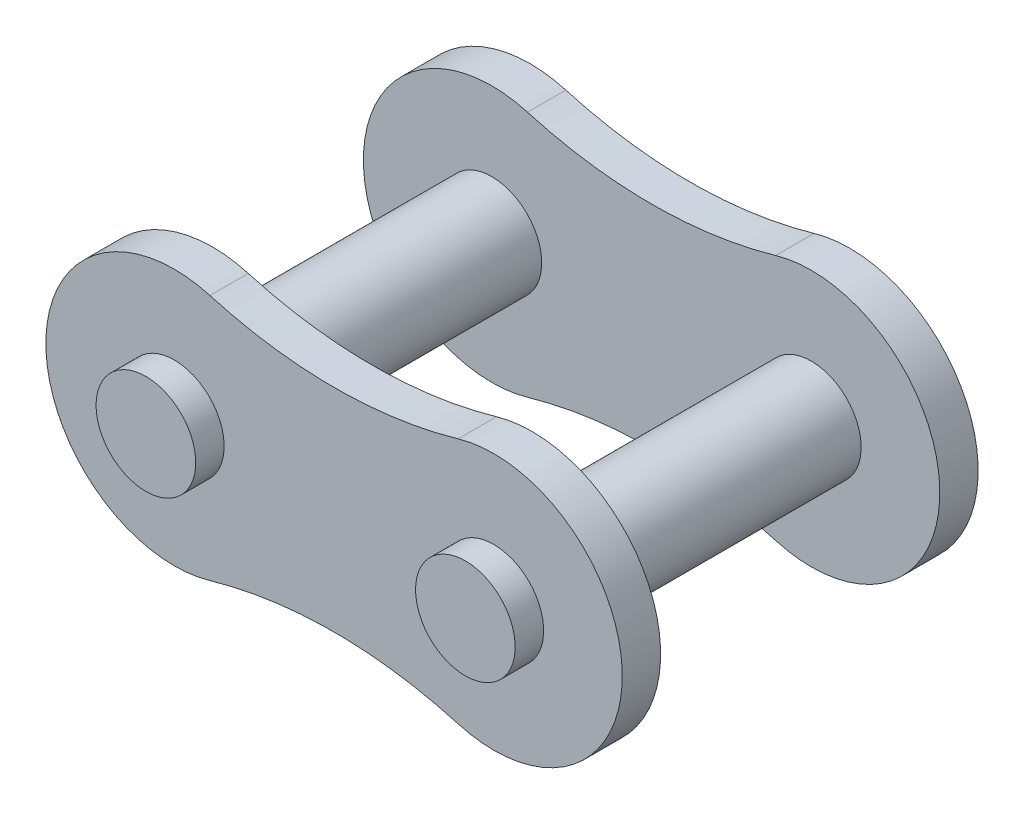
ISO-10303-21;
HEADER;
FILE_DESCRIPTION(('STEP AP214'),'2;1');
FILE_NAME('part.step','',(''),(''),'','','');
FILE_SCHEMA(('AUTOMOTIVE_DESIGN { 1 0 10303 214 1 1 1 1 }'));
ENDSEC;
DATA;
#1=APPLICATION_CONTEXT('core data for automotive mechanical design processes');
#2=APPLICATION_PROTOCOL_DEFINITION('international standard','automotive_design',2000,#1);
#3=PRODUCT_CONTEXT('',#1,'mechanical');
#4=PRODUCT('Part','Part','',(#3));
#5=PRODUCT_RELATED_PRODUCT_CATEGORY('part','',(#4));
#6=PRODUCT_DEFINITION_FORMATION('','',#4);
#7=PRODUCT_DEFINITION_CONTEXT('part definition',#1,'design');
#8=PRODUCT_DEFINITION('design','',#6,#7);
#9=PRODUCT_DEFINITION_SHAPE('','',#8);
#10=(LENGTH_UNIT() NAMED_UNIT(*) SI_UNIT(.MILLI.,.METRE.));
#11=(NAMED_UNIT(*) PLANE_ANGLE_UNIT() SI_UNIT($,.RADIAN.));
#12=(NAMED_UNIT(*) SI_UNIT($,.STERADIAN.) SOLID_ANGLE_UNIT());
#13=UNCERTAINTY_MEASURE_WITH_UNIT(LENGTH_MEASURE(1.E-05),#10,'distance_accuracy_value','');
#14=(GEOMETRIC_REPRESENTATION_CONTEXT(3) GLOBAL_UNCERTAINTY_ASSIGNED_CONTEXT((#13)) GLOBAL_UNIT_ASSIGNED_CONTEXT((#10,
#11,#12)) REPRESENTATION_CONTEXT('',''));
#15=CARTESIAN_POINT('',(0.,0.,0.));
#16=DIRECTION('',(0.,0.,1.));
#17=DIRECTION('',(1.,0.,0.));
#18=AXIS2_PLACEMENT_3D('',#15,#16,#17);
#19=CARTESIAN_POINT('',(44.45,0.,8.2042));
#20=DIRECTION('',(0.,0.,1.));
#21=DIRECTION('',(1.,0.,0.));
#22=AXIS2_PLACEMENT_3D('',#19,#20,#21);
#23=PLANE('',#22);
#24=CARTESIAN_POINT('',(44.45,0.,8.2042));
#25=DIRECTION('',(0.,0.,-1.));
#26=DIRECTION('',(-1.,0.,0.));
#27=AXIS2_PLACEMENT_3D('',#24,#25,#26);
#28=CIRCLE('',#27,1.9812);
#29=CARTESIAN_POINT('',(42.4688,0.,8.2042));
#30=VERTEX_POINT('',#29);
#31=EDGE_CURVE('E20',#30,#30,#28,.T.);
#32=ORIENTED_EDGE('',*,*,#31,.F.);
#33=EDGE_LOOP('',(#32));
#34=FACE_BOUND('',#33,.T.);
#35=ADVANCED_FACE('F17',(#34),#23,.T.);
#36=CARTESIAN_POINT('',(31.75,0.,8.2042));
#37=DIRECTION('',(0.,0.,1.));
#38=DIRECTION('',(1.,0.,0.));
#39=AXIS2_PLACEMENT_3D('',#36,#37,#38);
#40=PLANE('',#39);
#41=CARTESIAN_POINT('',(31.75,0.,8.2042));
#42=DIRECTION('',(0.,0.,-1.));
#43=DIRECTION('',(-1.,0.,0.));
#44=AXIS2_PLACEMENT_3D('',#41,#42,#43);
#45=CIRCLE('',#44,1.9812);
#46=CARTESIAN_POINT('',(29.7688,0.,8.2042));
#47=VERTEX_POINT('',#46);
#48=EDGE_CURVE('E171',#47,#47,#45,.T.);
#49=ORIENTED_EDGE('',*,*,#48,.F.);
#50=EDGE_LOOP('',(#49));
#51=FACE_BOUND('',#50,.T.);
#52=ADVANCED_FACE('F181',(#51),#40,.T.);
#53=CARTESIAN_POINT('',(44.45,0.,8.2042));
#54=DIRECTION('',(0.,0.,-1.));
#55=DIRECTION('',(-1.,0.,0.));
#56=AXIS2_PLACEMENT_3D('',#53,#54,#55);
#57=CYLINDRICAL_SURFACE('',#56,1.9812);
#58=CARTESIAN_POINT('',(44.45,0.,7.0739));
#59=DIRECTION('',(0.,0.,-1.));
#60=DIRECTION('',(-1.,0.,0.));
#61=AXIS2_PLACEMENT_3D('',#58,#59,#60);
#62=CIRCLE('',#61,1.9812);
#63=CARTESIAN_POINT('',(42.4688,0.,7.0739));
#64=VERTEX_POINT('',#63);
#65=EDGE_CURVE('E169',#64,#64,#62,.F.);
#66=ORIENTED_EDGE('',*,*,#65,.T.);
#67=EDGE_LOOP('',(#66));
#68=FACE_BOUND('',#67,.T.);
#69=ORIENTED_EDGE('',*,*,#31,.T.);
#70=EDGE_LOOP('',(#69));
#71=FACE_BOUND('',#70,.T.);
#72=ADVANCED_FACE('F178',(#68,#71),#57,.T.);
#73=CARTESIAN_POINT('',(31.75,0.,8.2042));
#74=DIRECTION('',(0.,0.,-1.));
#75=DIRECTION('',(-1.,0.,0.));
#76=AXIS2_PLACEMENT_3D('',#73,#74,#75);
#77=CYLINDRICAL_SURFACE('',#76,1.9812);
#78=ORIENTED_EDGE('',*,*,#48,.T.);
#79=EDGE_LOOP('',(#78));
#80=FACE_BOUND('',#79,.T.);
#81=CARTESIAN_POINT('',(31.75,0.,7.0739));
#82=DIRECTION('',(0.,0.,-1.));
#83=DIRECTION('',(-1.,0.,0.));
#84=AXIS2_PLACEMENT_3D('',#81,#82,#83);
#85=CIRCLE('',#84,1.9812);
#86=CARTESIAN_POINT('',(29.7688,0.,7.0739));
#87=VERTEX_POINT('',#86);
#88=EDGE_CURVE('E166',#87,#87,#85,.F.);
#89=ORIENTED_EDGE('',*,*,#88,.T.);
#90=EDGE_LOOP('',(#89));
#91=FACE_BOUND('',#90,.T.);
#92=ADVANCED_FACE('F256',(#80,#91),#77,.T.);
#93=CARTESIAN_POINT('',(44.45,0.,-8.2042));
#94=DIRECTION('',(0.,0.,1.));
#95=DIRECTION('',(1.,0.,0.));
#96=AXIS2_PLACEMENT_3D('',#93,#94,#95);
#97=PLANE('',#96);
#98=CARTESIAN_POINT('',(44.45,0.,-8.20420000000001));
#99=DIRECTION('',(0.,0.,-1.));
#100=DIRECTION('',(-1.,0.,0.));
#101=AXIS2_PLACEMENT_3D('',#98,#99,#100);
#102=CIRCLE('',#101,1.9812);
#103=CARTESIAN_POINT('',(42.4688,0.,-8.20420000000001));
#104=VERTEX_POINT('',#103);
#105=EDGE_CURVE('E163',#104,#104,#102,.F.);
#106=ORIENTED_EDGE('',*,*,#105,.F.);
#107=EDGE_LOOP('',(#106));
#108=FACE_BOUND('',#107,.T.);
#109=ADVANCED_FACE('F252',(#108),#97,.F.);
#110=CARTESIAN_POINT('',(31.75,0.,-8.2042));
#111=DIRECTION('',(0.,0.,1.));
#112=DIRECTION('',(1.,0.,0.));
#113=AXIS2_PLACEMENT_3D('',#110,#111,#112);
#114=PLANE('',#113);
#115=CARTESIAN_POINT('',(31.75,0.,-8.20420000000001));
#116=DIRECTION('',(0.,0.,-1.));
#117=DIRECTION('',(-1.,0.,0.));
#118=AXIS2_PLACEMENT_3D('',#115,#116,#117);
#119=CIRCLE('',#118,1.9812);
#120=CARTESIAN_POINT('',(29.7688,0.,-8.20420000000001));
#121=VERTEX_POINT('',#120);
#122=EDGE_CURVE('E98',#121,#121,#119,.F.);
#123=ORIENTED_EDGE('',*,*,#122,.F.);
#124=EDGE_LOOP('',(#123));
#125=FACE_BOUND('',#124,.T.);
#126=ADVANCED_FACE('F248',(#125),#114,.F.);
#127=CARTESIAN_POINT('',(41.275,10.9994867117524,7.0739));
#128=DIRECTION('',(0.,0.,-1.));
#129=DIRECTION('',(-1.,0.,0.));
#130=AXIS2_PLACEMENT_3D('',#127,#128,#129);
#131=PLANE('',#130);
#132=ORIENTED_EDGE('',*,*,#88,.F.);
#133=EDGE_LOOP('',(#132));
#134=FACE_BOUND('',#133,.T.);
#135=ORIENTED_EDGE('',*,*,#65,.F.);
#136=EDGE_LOOP('',(#135));
#137=FACE_BOUND('',#136,.T.);
#138=CARTESIAN_POINT('',(31.75,0.,7.0739));
#139=DIRECTION('',(0.,0.,-1.));
#140=DIRECTION('',(-1.,0.,0.));
#141=AXIS2_PLACEMENT_3D('',#138,#139,#140);
#142=CIRCLE('',#141,5.107432);
#143=CARTESIAN_POINT('',(33.1664321581491,-4.90709502414467,7.0739));
#144=VERTEX_POINT('',#143);
#145=CARTESIAN_POINT('',(33.1664321581491,4.90709502414467,7.0739));
#146=VERTEX_POINT('',#145);
#147=EDGE_CURVE('E158',#144,#146,#142,.T.);
#148=ORIENTED_EDGE('',*,*,#147,.F.);
#149=CARTESIAN_POINT('',(38.1,-21.9989734235048,7.0739));
#150=DIRECTION('',(0.,0.,-1.));
#151=DIRECTION('',(-1.,0.,0.));
#152=AXIS2_PLACEMENT_3D('',#149,#150,#151);
#153=CIRCLE('',#152,17.7896711287381);
#154=CARTESIAN_POINT('',(43.0335678418509,-4.90709502414468,7.0739));
#155=VERTEX_POINT('',#154);
#156=EDGE_CURVE('E86',#144,#155,#153,.T.);
#157=ORIENTED_EDGE('',*,*,#156,.T.);
#158=CARTESIAN_POINT('',(44.45,0.,7.0739));
#159=DIRECTION('',(0.,0.,-1.));
#160=DIRECTION('',(-1.,0.,0.));
#161=AXIS2_PLACEMENT_3D('',#158,#159,#160);
#162=CIRCLE('',#161,5.107432);
#163=CARTESIAN_POINT('',(43.0335678418509,4.90709502414463,7.0739));
#164=VERTEX_POINT('',#163);
#165=EDGE_CURVE('E80',#164,#155,#162,.T.);
#166=ORIENTED_EDGE('',*,*,#165,.F.);
#167=CARTESIAN_POINT('',(38.1,21.9989734235048,7.0739));
#168=DIRECTION('',(0.,0.,-1.));
#169=DIRECTION('',(-1.,0.,0.));
#170=AXIS2_PLACEMENT_3D('',#167,#168,#169);
#171=CIRCLE('',#170,17.7896711287381);
#172=EDGE_CURVE('E84',#164,#146,#171,.T.);
#173=ORIENTED_EDGE('',*,*,#172,.T.);
#174=EDGE_LOOP('',(#148,#157,#166,#173));
#175=FACE_BOUND('',#174,.T.);
#176=ADVANCED_FACE('F83',(#134,#137,#175),#131,.F.);
#177=CARTESIAN_POINT('',(44.45,0.,8.2042));
#178=DIRECTION('',(0.,0.,-1.));
#179=DIRECTION('',(-1.,0.,0.));
#180=AXIS2_PLACEMENT_3D('',#177,#178,#179);
#181=CYLINDRICAL_SURFACE('',#180,1.9812);
#182=ORIENTED_EDGE('',*,*,#105,.T.);
#183=EDGE_LOOP('',(#182));
#184=FACE_BOUND('',#183,.T.);
#185=CARTESIAN_POINT('',(44.45,0.,-7.0739));
#186=DIRECTION('',(0.,0.,-1.));
#187=DIRECTION('',(-1.,0.,0.));
#188=AXIS2_PLACEMENT_3D('',#185,#186,#187);
#189=CIRCLE('',#188,1.9812);
#190=CARTESIAN_POINT('',(42.4688,0.,-7.0739));
#191=VERTEX_POINT('',#190);
#192=EDGE_CURVE('E155',#191,#191,#189,.T.);
#193=ORIENTED_EDGE('',*,*,#192,.T.);
#194=EDGE_LOOP('',(#193));
#195=FACE_BOUND('',#194,.T.);
#196=ADVANCED_FACE('F241',(#184,#195),#181,.T.);
#197=CARTESIAN_POINT('',(31.75,0.,8.2042));
#198=DIRECTION('',(0.,0.,-1.));
#199=DIRECTION('',(-1.,0.,0.));
#200=AXIS2_PLACEMENT_3D('',#197,#198,#199);
#201=CYLINDRICAL_SURFACE('',#200,1.9812);
#202=ORIENTED_EDGE('',*,*,#122,.T.);
#203=EDGE_LOOP('',(#202));
#204=FACE_BOUND('',#203,.T.);
#205=CARTESIAN_POINT('',(31.75,0.,-7.07389999999999));
#206=DIRECTION('',(0.,0.,-1.));
#207=DIRECTION('',(-1.,0.,0.));
#208=AXIS2_PLACEMENT_3D('',#205,#206,#207);
#209=CIRCLE('',#208,1.9812);
#210=CARTESIAN_POINT('',(29.7688,0.,-7.07389999999999));
#211=VERTEX_POINT('',#210);
#212=EDGE_CURVE('E152',#211,#211,#209,.T.);
#213=ORIENTED_EDGE('',*,*,#212,.T.);
#214=EDGE_LOOP('',(#213));
#215=FACE_BOUND('',#214,.T.);
#216=ADVANCED_FACE('F238',(#204,#215),#201,.T.);
#217=CARTESIAN_POINT('',(38.1,21.9989734235048,7.0739));
#218=DIRECTION('',(0.,0.,-1.));
#219=DIRECTION('',(-1.,0.,0.));
#220=AXIS2_PLACEMENT_3D('',#217,#218,#219);
#221=CYLINDRICAL_SURFACE('',#220,17.7896711287381);
#222=DIRECTION('',(0.,0.,-1.));
#223=VECTOR('',#222,1.);
#224=CARTESIAN_POINT('',(33.1664321581491,4.90709502414464,7.0739));
#225=LINE('',#224,#223);
#226=CARTESIAN_POINT('',(33.1664321581491,4.90709502414467,5.5499));
#227=VERTEX_POINT('',#226);
#228=EDGE_CURVE('E96',#146,#227,#225,.T.);
#229=ORIENTED_EDGE('',*,*,#228,.F.);
#230=ORIENTED_EDGE('',*,*,#172,.F.);
#231=DIRECTION('',(0.,0.,-1.));
#232=VECTOR('',#231,1.);
#233=CARTESIAN_POINT('',(43.0335678418508,4.90709502414461,7.0739));
#234=LINE('',#233,#232);
#235=CARTESIAN_POINT('',(43.0335678418509,4.90709502414463,5.5499));
#236=VERTEX_POINT('',#235);
#237=EDGE_CURVE('E90',#236,#164,#234,.F.);
#238=ORIENTED_EDGE('',*,*,#237,.F.);
#239=CARTESIAN_POINT('',(38.1,21.9989734235048,5.5499));
#240=DIRECTION('',(0.,0.,-1.));
#241=DIRECTION('',(-1.,0.,0.));
#242=AXIS2_PLACEMENT_3D('',#239,#240,#241);
#243=CIRCLE('',#242,17.7896711287381);
#244=EDGE_CURVE('E150',#227,#236,#243,.F.);
#245=ORIENTED_EDGE('',*,*,#244,.F.);
#246=EDGE_LOOP('',(#229,#230,#238,#245));
#247=FACE_BOUND('',#246,.T.);
#248=ADVANCED_FACE('F93',(#247),#221,.F.);
#249=CARTESIAN_POINT('',(44.45,0.,7.0739));
#250=DIRECTION('',(0.,0.,-1.));
#251=DIRECTION('',(-1.,0.,0.));
#252=AXIS2_PLACEMENT_3D('',#249,#250,#251);
#253=CYLINDRICAL_SURFACE('',#252,5.107432);
#254=CARTESIAN_POINT('',(44.45,0.,5.5499));
#255=DIRECTION('',(0.,0.,-1.));
#256=DIRECTION('',(-1.,0.,0.));
#257=AXIS2_PLACEMENT_3D('',#254,#255,#256);
#258=CIRCLE('',#257,5.107432);
#259=CARTESIAN_POINT('',(43.0335678418509,-4.90709502414468,5.5499));
#260=VERTEX_POINT('',#259);
#261=EDGE_CURVE('E102',#236,#260,#258,.T.);
#262=ORIENTED_EDGE('',*,*,#261,.F.);
#263=ORIENTED_EDGE('',*,*,#237,.T.);
#264=ORIENTED_EDGE('',*,*,#165,.T.);
#265=DIRECTION('',(0.,0.,-1.));
#266=VECTOR('',#265,1.);
#267=CARTESIAN_POINT('',(43.0335678418508,-4.90709502414466,7.0739));
#268=LINE('',#267,#266);
#269=EDGE_CURVE('E105',#155,#260,#268,.T.);
#270=ORIENTED_EDGE('',*,*,#269,.T.);
#271=EDGE_LOOP('',(#262,#263,#264,#270));
#272=FACE_BOUND('',#271,.T.);
#273=ADVANCED_FACE('F100',(#272),#253,.T.);
#274=CARTESIAN_POINT('',(38.1,-21.9989734235048,7.0739));
#275=DIRECTION('',(0.,0.,-1.));
#276=DIRECTION('',(-1.,0.,0.));
#277=AXIS2_PLACEMENT_3D('',#274,#275,#276);
#278=CYLINDRICAL_SURFACE('',#277,17.7896711287381);
#279=ORIENTED_EDGE('',*,*,#269,.F.);
#280=ORIENTED_EDGE('',*,*,#156,.F.);
#281=DIRECTION('',(0.,0.,-1.));
#282=VECTOR('',#281,1.);
#283=CARTESIAN_POINT('',(33.1664321581491,-4.90709502414464,7.0739));
#284=LINE('',#283,#282);
#285=CARTESIAN_POINT('',(33.1664321581491,-4.90709502414465,5.5499));
#286=VERTEX_POINT('',#285);
#287=EDGE_CURVE('E159',#286,#144,#284,.F.);
#288=ORIENTED_EDGE('',*,*,#287,.F.);
#289=CARTESIAN_POINT('',(38.1,-21.9989734235048,5.5499));
#290=DIRECTION('',(0.,0.,-1.));
#291=DIRECTION('',(-1.,0.,0.));
#292=AXIS2_PLACEMENT_3D('',#289,#290,#291);
#293=CIRCLE('',#292,17.7896711287381);
#294=EDGE_CURVE('E146',#260,#286,#293,.F.);
#295=ORIENTED_EDGE('',*,*,#294,.F.);
#296=EDGE_LOOP('',(#279,#280,#288,#295));
#297=FACE_BOUND('',#296,.T.);
#298=ADVANCED_FACE('F229',(#297),#278,.F.);
#299=CARTESIAN_POINT('',(31.75,0.,7.0739));
#300=DIRECTION('',(0.,0.,-1.));
#301=DIRECTION('',(-1.,0.,0.));
#302=AXIS2_PLACEMENT_3D('',#299,#300,#301);
#303=CYLINDRICAL_SURFACE('',#302,5.107432);
#304=ORIENTED_EDGE('',*,*,#147,.T.);
#305=ORIENTED_EDGE('',*,*,#228,.T.);
#306=CARTESIAN_POINT('',(31.75,0.,5.5499));
#307=DIRECTION('',(0.,0.,-1.));
#308=DIRECTION('',(-1.,0.,0.));
#309=AXIS2_PLACEMENT_3D('',#306,#307,#308);
#310=CIRCLE('',#309,5.107432);
#311=EDGE_CURVE('E143',#286,#227,#310,.T.);
#312=ORIENTED_EDGE('',*,*,#311,.F.);
#313=ORIENTED_EDGE('',*,*,#287,.T.);
#314=EDGE_LOOP('',(#304,#305,#312,#313));
#315=FACE_BOUND('',#314,.T.);
#316=ADVANCED_FACE('F225',(#315),#303,.T.);
#317=CARTESIAN_POINT('',(41.275,10.9994867117524,-7.0739));
#318=DIRECTION('',(0.,0.,1.));
#319=DIRECTION('',(1.,0.,0.));
#320=AXIS2_PLACEMENT_3D('',#317,#318,#319);
#321=PLANE('',#320);
#322=ORIENTED_EDGE('',*,*,#212,.F.);
#323=EDGE_LOOP('',(#322));
#324=FACE_BOUND('',#323,.T.);
#325=ORIENTED_EDGE('',*,*,#192,.F.);
#326=EDGE_LOOP('',(#325));
#327=FACE_BOUND('',#326,.T.);
#328=CARTESIAN_POINT('',(44.45,0.,-7.0739));
#329=DIRECTION('',(0.,0.,1.));
#330=DIRECTION('',(1.,0.,0.));
#331=AXIS2_PLACEMENT_3D('',#328,#329,#330);
#332=CIRCLE('',#331,5.107432);
#333=CARTESIAN_POINT('',(43.0335678418509,-4.90709502414463,-7.0739));
#334=VERTEX_POINT('',#333);
#335=CARTESIAN_POINT('',(43.0335678418509,4.90709502414466,-7.0739));
#336=VERTEX_POINT('',#335);
#337=EDGE_CURVE('E130',#334,#336,#332,.T.);
#338=ORIENTED_EDGE('',*,*,#337,.F.);
#339=CARTESIAN_POINT('',(38.1,-21.9989734235048,-7.0739));
#340=DIRECTION('',(0.,0.,1.));
#341=DIRECTION('',(1.,0.,0.));
#342=AXIS2_PLACEMENT_3D('',#339,#340,#341);
#343=CIRCLE('',#342,17.7896711287381);
#344=CARTESIAN_POINT('',(33.1664321581491,-4.9070950241447,-7.0739));
#345=VERTEX_POINT('',#344);
#346=EDGE_CURVE('E135',#334,#345,#343,.T.);
#347=ORIENTED_EDGE('',*,*,#346,.T.);
#348=CARTESIAN_POINT('',(31.75,0.,-7.0739));
#349=DIRECTION('',(0.,0.,1.));
#350=DIRECTION('',(1.,0.,0.));
#351=AXIS2_PLACEMENT_3D('',#348,#349,#350);
#352=CIRCLE('',#351,5.107432);
#353=CARTESIAN_POINT('',(33.1664321581491,4.90709502414467,-7.0739));
#354=VERTEX_POINT('',#353);
#355=EDGE_CURVE('E137',#354,#345,#352,.T.);
#356=ORIENTED_EDGE('',*,*,#355,.F.);
#357=CARTESIAN_POINT('',(38.1,21.9989734235048,-7.0739));
#358=DIRECTION('',(0.,0.,1.));
#359=DIRECTION('',(1.,0.,0.));
#360=AXIS2_PLACEMENT_3D('',#357,#358,#359);
#361=CIRCLE('',#360,17.7896711287381);
#362=EDGE_CURVE('E141',#354,#336,#361,.T.);
#363=ORIENTED_EDGE('',*,*,#362,.T.);
#364=EDGE_LOOP('',(#338,#347,#356,#363));
#365=FACE_BOUND('',#364,.T.);
#366=ADVANCED_FACE('F221',(#324,#327,#365),#321,.F.);
#367=CARTESIAN_POINT('',(41.275,10.9994867117524,5.5499));
#368=DIRECTION('',(0.,0.,-1.));
#369=DIRECTION('',(-1.,0.,0.));
#370=AXIS2_PLACEMENT_3D('',#367,#368,#369);
#371=PLANE('',#370);
#372=CARTESIAN_POINT('',(31.75,0.,5.5499));
#373=DIRECTION('',(0.,0.,-1.));
#374=DIRECTION('',(-1.,0.,0.));
#375=AXIS2_PLACEMENT_3D('',#372,#373,#374);
#376=CIRCLE('',#375,1.9812);
#377=CARTESIAN_POINT('',(29.7688,0.,5.5499));
#378=VERTEX_POINT('',#377);
#379=EDGE_CURVE('E127',#378,#378,#376,.T.);
#380=ORIENTED_EDGE('',*,*,#379,.F.);
#381=EDGE_LOOP('',(#380));
#382=FACE_BOUND('',#381,.T.);
#383=CARTESIAN_POINT('',(44.45,0.,5.5499));
#384=DIRECTION('',(0.,0.,-1.));
#385=DIRECTION('',(-1.,0.,0.));
#386=AXIS2_PLACEMENT_3D('',#383,#384,#385);
#387=CIRCLE('',#386,1.9812);
#388=CARTESIAN_POINT('',(42.4688,0.,5.5499));
#389=VERTEX_POINT('',#388);
#390=EDGE_CURVE('E124',#389,#389,#387,.T.);
#391=ORIENTED_EDGE('',*,*,#390,.F.);
#392=EDGE_LOOP('',(#391));
#393=FACE_BOUND('',#392,.T.);
#394=ORIENTED_EDGE('',*,*,#294,.T.);
#395=ORIENTED_EDGE('',*,*,#311,.T.);
#396=ORIENTED_EDGE('',*,*,#244,.T.);
#397=ORIENTED_EDGE('',*,*,#261,.T.);
#398=EDGE_LOOP('',(#394,#395,#396,#397));
#399=FACE_BOUND('',#398,.T.);
#400=ADVANCED_FACE('F217',(#382,#393,#399),#371,.T.);
#401=CARTESIAN_POINT('',(38.1,21.9989734235048,-7.0739));
#402=DIRECTION('',(0.,0.,1.));
#403=DIRECTION('',(1.,0.,0.));
#404=AXIS2_PLACEMENT_3D('',#401,#402,#403);
#405=CYLINDRICAL_SURFACE('',#404,17.7896711287381);
#406=DIRECTION('',(0.,0.,1.));
#407=VECTOR('',#406,1.);
#408=CARTESIAN_POINT('',(43.0335678418508,4.90709502414461,-7.0739));
#409=LINE('',#408,#407);
#410=CARTESIAN_POINT('',(43.0335678418509,4.90709502414466,-5.5499));
#411=VERTEX_POINT('',#410);
#412=EDGE_CURVE('E133',#336,#411,#409,.T.);
#413=ORIENTED_EDGE('',*,*,#412,.F.);
#414=ORIENTED_EDGE('',*,*,#362,.F.);
#415=DIRECTION('',(0.,0.,1.));
#416=VECTOR('',#415,1.);
#417=CARTESIAN_POINT('',(33.1664321581491,4.90709502414464,-7.0739));
#418=LINE('',#417,#416);
#419=CARTESIAN_POINT('',(33.1664321581491,4.90709502414465,-5.54989999999999));
#420=VERTEX_POINT('',#419);
#421=EDGE_CURVE('E140',#420,#354,#418,.F.);
#422=ORIENTED_EDGE('',*,*,#421,.F.);
#423=CARTESIAN_POINT('',(38.1,21.9989734235048,-5.5499));
#424=DIRECTION('',(0.,0.,1.));
#425=DIRECTION('',(1.,0.,0.));
#426=AXIS2_PLACEMENT_3D('',#423,#424,#425);
#427=CIRCLE('',#426,17.7896711287381);
#428=EDGE_CURVE('E121',#411,#420,#427,.F.);
#429=ORIENTED_EDGE('',*,*,#428,.F.);
#430=EDGE_LOOP('',(#413,#414,#422,#429));
#431=FACE_BOUND('',#430,.T.);
#432=ADVANCED_FACE('F213',(#431),#405,.F.);
#433=CARTESIAN_POINT('',(31.75,0.,-7.0739));
#434=DIRECTION('',(0.,0.,1.));
#435=DIRECTION('',(1.,0.,0.));
#436=AXIS2_PLACEMENT_3D('',#433,#434,#435);
#437=CYLINDRICAL_SURFACE('',#436,5.107432);
#438=ORIENTED_EDGE('',*,*,#355,.T.);
#439=DIRECTION('',(0.,0.,1.));
#440=VECTOR('',#439,1.);
#441=CARTESIAN_POINT('',(33.1664321581491,-4.90709502414469,-7.0739));
#442=LINE('',#441,#440);
#443=CARTESIAN_POINT('',(33.1664321581491,-4.9070950241447,-5.54989999999998));
#444=VERTEX_POINT('',#443);
#445=EDGE_CURVE('E134',#345,#444,#442,.T.);
#446=ORIENTED_EDGE('',*,*,#445,.T.);
#447=CARTESIAN_POINT('',(31.75,0.,-5.54989999999998));
#448=DIRECTION('',(0.,0.,1.));
#449=DIRECTION('',(1.,0.,0.));
#450=AXIS2_PLACEMENT_3D('',#447,#448,#449);
#451=CIRCLE('',#450,5.107432);
#452=EDGE_CURVE('E118',#420,#444,#451,.T.);
#453=ORIENTED_EDGE('',*,*,#452,.F.);
#454=ORIENTED_EDGE('',*,*,#421,.T.);
#455=EDGE_LOOP('',(#438,#446,#453,#454));
#456=FACE_BOUND('',#455,.T.);
#457=ADVANCED_FACE('F210',(#456),#437,.T.);
#458=CARTESIAN_POINT('',(38.1,-21.9989734235048,-7.0739));
#459=DIRECTION('',(0.,0.,1.));
#460=DIRECTION('',(1.,0.,0.));
#461=AXIS2_PLACEMENT_3D('',#458,#459,#460);
#462=CYLINDRICAL_SURFACE('',#461,17.7896711287381);
#463=ORIENTED_EDGE('',*,*,#445,.F.);
#464=ORIENTED_EDGE('',*,*,#346,.F.);
#465=DIRECTION('',(0.,0.,1.));
#466=VECTOR('',#465,1.);
#467=CARTESIAN_POINT('',(43.0335678418508,-4.90709502414461,-7.0739));
#468=LINE('',#467,#466);
#469=CARTESIAN_POINT('',(43.0335678418509,-4.90709502414463,-5.54989999999999));
#470=VERTEX_POINT('',#469);
#471=EDGE_CURVE('E35',#470,#334,#468,.F.);
#472=ORIENTED_EDGE('',*,*,#471,.F.);
#473=CARTESIAN_POINT('',(38.1,-21.9989734235048,-5.54989999999998));
#474=DIRECTION('',(0.,0.,1.));
#475=DIRECTION('',(1.,0.,0.));
#476=AXIS2_PLACEMENT_3D('',#473,#474,#475);
#477=CIRCLE('',#476,17.7896711287381);
#478=EDGE_CURVE('E115',#444,#470,#477,.F.);
#479=ORIENTED_EDGE('',*,*,#478,.F.);
#480=EDGE_LOOP('',(#463,#464,#472,#479));
#481=FACE_BOUND('',#480,.T.);
#482=ADVANCED_FACE('F206',(#481),#462,.F.);
#483=CARTESIAN_POINT('',(44.45,0.,-7.0739));
#484=DIRECTION('',(0.,0.,1.));
#485=DIRECTION('',(1.,0.,0.));
#486=AXIS2_PLACEMENT_3D('',#483,#484,#485);
#487=CYLINDRICAL_SURFACE('',#486,5.107432);
#488=CARTESIAN_POINT('',(44.45,0.,-5.5499));
#489=DIRECTION('',(0.,0.,1.));
#490=DIRECTION('',(1.,0.,0.));
#491=AXIS2_PLACEMENT_3D('',#488,#489,#490);
#492=CIRCLE('',#491,5.107432);
#493=EDGE_CURVE('E112',#470,#411,#492,.T.);
#494=ORIENTED_EDGE('',*,*,#493,.F.);
#495=ORIENTED_EDGE('',*,*,#471,.T.);
#496=ORIENTED_EDGE('',*,*,#337,.T.);
#497=ORIENTED_EDGE('',*,*,#412,.T.);
#498=EDGE_LOOP('',(#494,#495,#496,#497));
#499=FACE_BOUND('',#498,.T.);
#500=ADVANCED_FACE('F202',(#499),#487,.T.);
#501=CARTESIAN_POINT('',(31.75,0.,8.2042));
#502=DIRECTION('',(0.,0.,-1.));
#503=DIRECTION('',(-1.,0.,0.));
#504=AXIS2_PLACEMENT_3D('',#501,#502,#503);
#505=CYLINDRICAL_SURFACE('',#504,1.9812);
#506=CARTESIAN_POINT('',(31.75,0.,-5.54989999999998));
#507=DIRECTION('',(0.,0.,-1.));
#508=DIRECTION('',(-1.,0.,0.));
#509=AXIS2_PLACEMENT_3D('',#506,#507,#508);
#510=CIRCLE('',#509,1.9812);
#511=CARTESIAN_POINT('',(29.7688,0.,-5.54989999999998));
#512=VERTEX_POINT('',#511);
#513=EDGE_CURVE('E26',#512,#512,#510,.T.);
#514=ORIENTED_EDGE('',*,*,#513,.F.);
#515=EDGE_LOOP('',(#514));
#516=FACE_BOUND('',#515,.T.);
#517=ORIENTED_EDGE('',*,*,#379,.T.);
#518=EDGE_LOOP('',(#517));
#519=FACE_BOUND('',#518,.T.);
#520=ADVANCED_FACE('F195',(#516,#519),#505,.T.);
#521=CARTESIAN_POINT('',(44.45,0.,8.2042));
#522=DIRECTION('',(0.,0.,-1.));
#523=DIRECTION('',(-1.,0.,0.));
#524=AXIS2_PLACEMENT_3D('',#521,#522,#523);
#525=CYLINDRICAL_SURFACE('',#524,1.9812);
#526=CARTESIAN_POINT('',(44.45,0.,-5.5499));
#527=DIRECTION('',(0.,0.,-1.));
#528=DIRECTION('',(-1.,0.,0.));
#529=AXIS2_PLACEMENT_3D('',#526,#527,#528);
#530=CIRCLE('',#529,1.9812);
#531=CARTESIAN_POINT('',(42.4688,0.,-5.5499));
#532=VERTEX_POINT('',#531);
#533=EDGE_CURVE('E11',#532,#532,#530,.T.);
#534=ORIENTED_EDGE('',*,*,#533,.F.);
#535=EDGE_LOOP('',(#534));
#536=FACE_BOUND('',#535,.T.);
#537=ORIENTED_EDGE('',*,*,#390,.T.);
#538=EDGE_LOOP('',(#537));
#539=FACE_BOUND('',#538,.T.);
#540=ADVANCED_FACE('F189',(#536,#539),#525,.T.);
#541=CARTESIAN_POINT('',(41.275,10.9994867117524,-5.5499));
#542=DIRECTION('',(0.,0.,1.));
#543=DIRECTION('',(1.,0.,0.));
#544=AXIS2_PLACEMENT_3D('',#541,#542,#543);
#545=PLANE('',#544);
#546=ORIENTED_EDGE('',*,*,#533,.T.);
#547=EDGE_LOOP('',(#546));
#548=FACE_BOUND('',#547,.T.);
#549=ORIENTED_EDGE('',*,*,#513,.T.);
#550=EDGE_LOOP('',(#549));
#551=FACE_BOUND('',#550,.T.);
#552=ORIENTED_EDGE('',*,*,#478,.T.);
#553=ORIENTED_EDGE('',*,*,#493,.T.);
#554=ORIENTED_EDGE('',*,*,#428,.T.);
#555=ORIENTED_EDGE('',*,*,#452,.T.);
#556=EDGE_LOOP('',(#552,#553,#554,#555));
#557=FACE_BOUND('',#556,.T.);
#558=ADVANCED_FACE('F187',(#548,#551,#557),#545,.T.);
#559=CLOSED_SHELL('',(#35,#52,#72,#92,#109,#126,#176,#196,#216,#248,#273,#298,#316,#366,#400,
#432,#457,#482,#500,#520,#540,#558));
#560=MANIFOLD_SOLID_BREP('B1',#559);
#561=ADVANCED_BREP_SHAPE_REPRESENTATION('',(#18,#560),#14);
#562=SHAPE_DEFINITION_REPRESENTATION(#9,#561);
ENDSEC;
END-ISO-10303-21;
